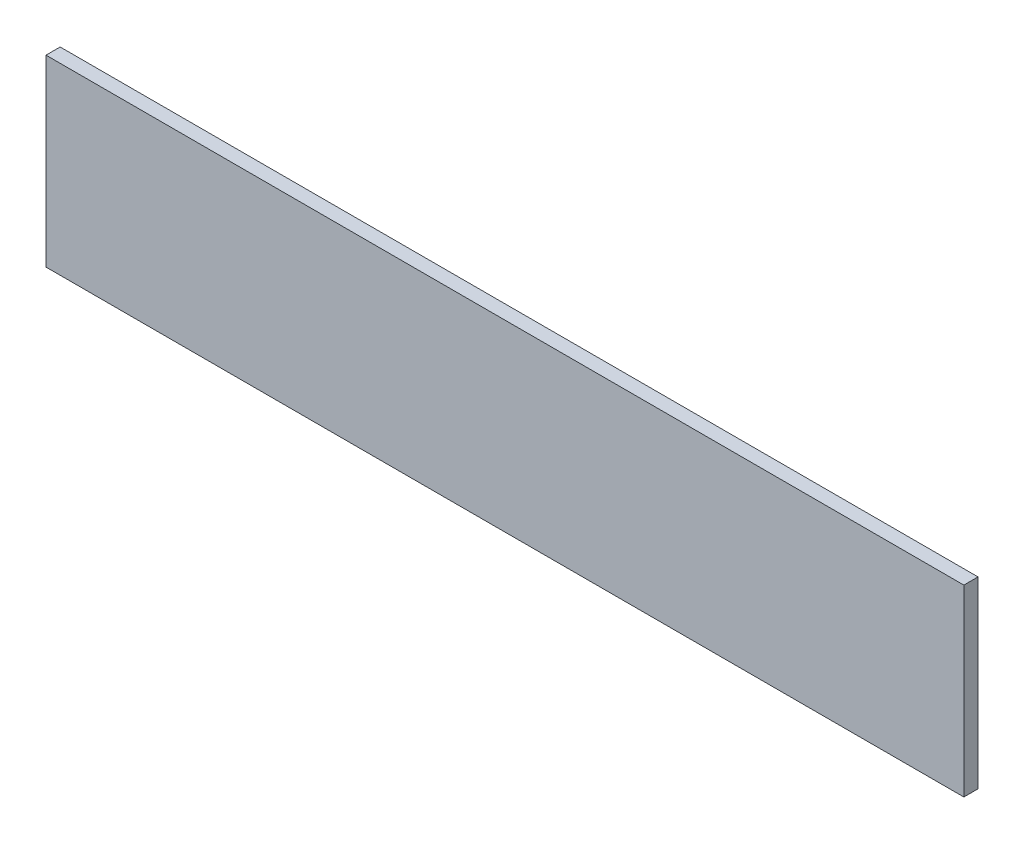
ISO-10303-21;
HEADER;
FILE_DESCRIPTION(('STEP AP214'),'2;1');
FILE_NAME('part.step','',(''),(''),'','','');
FILE_SCHEMA(('AUTOMOTIVE_DESIGN { 1 0 10303 214 1 1 1 1 }'));
ENDSEC;
DATA;
#1=APPLICATION_CONTEXT('core data for automotive mechanical design processes');
#2=APPLICATION_PROTOCOL_DEFINITION('international standard','automotive_design',2000,#1);
#3=PRODUCT_CONTEXT('',#1,'mechanical');
#4=PRODUCT('Part','Part','',(#3));
#5=PRODUCT_RELATED_PRODUCT_CATEGORY('part','',(#4));
#6=PRODUCT_DEFINITION_FORMATION('','',#4);
#7=PRODUCT_DEFINITION_CONTEXT('part definition',#1,'design');
#8=PRODUCT_DEFINITION('design','',#6,#7);
#9=PRODUCT_DEFINITION_SHAPE('','',#8);
#10=(LENGTH_UNIT() NAMED_UNIT(*) SI_UNIT(.MILLI.,.METRE.));
#11=(NAMED_UNIT(*) PLANE_ANGLE_UNIT() SI_UNIT($,.RADIAN.));
#12=(NAMED_UNIT(*) SI_UNIT($,.STERADIAN.) SOLID_ANGLE_UNIT());
#13=UNCERTAINTY_MEASURE_WITH_UNIT(LENGTH_MEASURE(1.E-05),#10,'distance_accuracy_value','');
#14=(GEOMETRIC_REPRESENTATION_CONTEXT(3) GLOBAL_UNCERTAINTY_ASSIGNED_CONTEXT((#13)) GLOBAL_UNIT_ASSIGNED_CONTEXT((#10,
#11,#12)) REPRESENTATION_CONTEXT('',''));
#15=CARTESIAN_POINT('',(0.,0.,0.));
#16=DIRECTION('',(0.,0.,1.));
#17=DIRECTION('',(1.,0.,0.));
#18=AXIS2_PLACEMENT_3D('',#15,#16,#17);
#19=CARTESIAN_POINT('',(40.0931352948155,17.0250433275563,3.));
#20=DIRECTION('',(-1.,0.,0.));
#21=DIRECTION('',(0.,0.,1.));
#22=AXIS2_PLACEMENT_3D('',#19,#20,#21);
#23=PLANE('',#22);
#24=DIRECTION('',(0.,1.,0.));
#25=VECTOR('',#24,1.);
#26=CARTESIAN_POINT('',(40.0931352948155,17.0250433275563,0.));
#27=LINE('',#26,#25);
#28=CARTESIAN_POINT('',(40.0931352948155,-21.8893414211439,0.));
#29=VERTEX_POINT('',#28);
#30=CARTESIAN_POINT('',(40.0931352948155,17.0250433275563,0.));
#31=VERTEX_POINT('',#30);
#32=EDGE_CURVE('E98',#29,#31,#27,.T.);
#33=ORIENTED_EDGE('',*,*,#32,.T.);
#34=DIRECTION('',(0.,0.,-1.));
#35=VECTOR('',#34,1.);
#36=CARTESIAN_POINT('',(40.0931352948155,17.0250433275563,3.));
#37=LINE('',#36,#35);
#38=CARTESIAN_POINT('',(40.0931352948155,17.0250433275563,3.));
#39=VERTEX_POINT('',#38);
#40=EDGE_CURVE('E11',#39,#31,#37,.T.);
#41=ORIENTED_EDGE('',*,*,#40,.F.);
#42=DIRECTION('',(0.,1.,0.));
#43=VECTOR('',#42,1.);
#44=CARTESIAN_POINT('',(40.0931352948155,17.0250433275563,3.));
#45=LINE('',#44,#43);
#46=CARTESIAN_POINT('',(40.0931352948155,-21.8893414211439,3.));
#47=VERTEX_POINT('',#46);
#48=EDGE_CURVE('E86',#47,#39,#45,.T.);
#49=ORIENTED_EDGE('',*,*,#48,.F.);
#50=DIRECTION('',(0.,0.,-1.));
#51=VECTOR('',#50,1.);
#52=CARTESIAN_POINT('',(40.0931352948155,-21.8893414211439,3.));
#53=LINE('',#52,#51);
#54=EDGE_CURVE('E94',#47,#29,#53,.T.);
#55=ORIENTED_EDGE('',*,*,#54,.T.);
#56=EDGE_LOOP('',(#33,#41,#49,#55));
#57=FACE_BOUND('',#56,.T.);
#58=ADVANCED_FACE('F35',(#57),#23,.F.);
#59=CARTESIAN_POINT('',(-154.478788448685,17.0250433275563,3.));
#60=DIRECTION('',(0.,-1.,0.));
#61=DIRECTION('',(0.,0.,-1.));
#62=AXIS2_PLACEMENT_3D('',#59,#60,#61);
#63=PLANE('',#62);
#64=DIRECTION('',(-1.,0.,0.));
#65=VECTOR('',#64,1.);
#66=CARTESIAN_POINT('',(-154.478788448685,17.0250433275563,0.));
#67=LINE('',#66,#65);
#68=CARTESIAN_POINT('',(-154.478788448685,17.0250433275563,0.));
#69=VERTEX_POINT('',#68);
#70=EDGE_CURVE('E90',#31,#69,#67,.T.);
#71=ORIENTED_EDGE('',*,*,#70,.T.);
#72=DIRECTION('',(0.,0.,-1.));
#73=VECTOR('',#72,1.);
#74=CARTESIAN_POINT('',(-154.478788448685,17.0250433275563,3.));
#75=LINE('',#74,#73);
#76=CARTESIAN_POINT('',(-154.478788448685,17.0250433275563,3.));
#77=VERTEX_POINT('',#76);
#78=EDGE_CURVE('E43',#77,#69,#75,.T.);
#79=ORIENTED_EDGE('',*,*,#78,.F.);
#80=DIRECTION('',(-1.,0.,0.));
#81=VECTOR('',#80,1.);
#82=CARTESIAN_POINT('',(-154.478788448685,17.0250433275563,3.));
#83=LINE('',#82,#81);
#84=EDGE_CURVE('E81',#39,#77,#83,.T.);
#85=ORIENTED_EDGE('',*,*,#84,.F.);
#86=ORIENTED_EDGE('',*,*,#40,.T.);
#87=EDGE_LOOP('',(#71,#79,#85,#86));
#88=FACE_BOUND('',#87,.T.);
#89=ADVANCED_FACE('F89',(#88),#63,.F.);
#90=CARTESIAN_POINT('',(-154.478788448685,17.0250433275563,3.));
#91=DIRECTION('',(1.,0.,0.));
#92=DIRECTION('',(0.,0.,-1.));
#93=AXIS2_PLACEMENT_3D('',#90,#91,#92);
#94=PLANE('',#93);
#95=DIRECTION('',(0.,-1.,0.));
#96=VECTOR('',#95,1.);
#97=CARTESIAN_POINT('',(-154.478788448685,17.0250433275563,0.));
#98=LINE('',#97,#96);
#99=CARTESIAN_POINT('',(-154.478788448685,-21.8893414211439,0.));
#100=VERTEX_POINT('',#99);
#101=EDGE_CURVE('E68',#69,#100,#98,.T.);
#102=ORIENTED_EDGE('',*,*,#101,.T.);
#103=DIRECTION('',(0.,0.,-1.));
#104=VECTOR('',#103,1.);
#105=CARTESIAN_POINT('',(-154.478788448685,-21.8893414211439,3.));
#106=LINE('',#105,#104);
#107=CARTESIAN_POINT('',(-154.478788448685,-21.8893414211439,3.));
#108=VERTEX_POINT('',#107);
#109=EDGE_CURVE('E91',#108,#100,#106,.T.);
#110=ORIENTED_EDGE('',*,*,#109,.F.);
#111=DIRECTION('',(0.,-1.,0.));
#112=VECTOR('',#111,1.);
#113=CARTESIAN_POINT('',(-154.478788448685,17.0250433275563,3.));
#114=LINE('',#113,#112);
#115=EDGE_CURVE('E84',#77,#108,#114,.T.);
#116=ORIENTED_EDGE('',*,*,#115,.F.);
#117=ORIENTED_EDGE('',*,*,#78,.T.);
#118=EDGE_LOOP('',(#102,#110,#116,#117));
#119=FACE_BOUND('',#118,.T.);
#120=ADVANCED_FACE('F92',(#119),#94,.F.);
#121=CARTESIAN_POINT('',(-154.478788448685,-21.8893414211439,3.));
#122=DIRECTION('',(0.,1.,0.));
#123=DIRECTION('',(0.,0.,1.));
#124=AXIS2_PLACEMENT_3D('',#121,#122,#123);
#125=PLANE('',#124);
#126=DIRECTION('',(1.,0.,0.));
#127=VECTOR('',#126,1.);
#128=CARTESIAN_POINT('',(-154.478788448685,-21.8893414211439,0.));
#129=LINE('',#128,#127);
#130=EDGE_CURVE('E74',#100,#29,#129,.T.);
#131=ORIENTED_EDGE('',*,*,#130,.T.);
#132=ORIENTED_EDGE('',*,*,#54,.F.);
#133=DIRECTION('',(1.,0.,0.));
#134=VECTOR('',#133,1.);
#135=CARTESIAN_POINT('',(-154.478788448685,-21.8893414211439,3.));
#136=LINE('',#135,#134);
#137=EDGE_CURVE('E51',#108,#47,#136,.T.);
#138=ORIENTED_EDGE('',*,*,#137,.F.);
#139=ORIENTED_EDGE('',*,*,#109,.T.);
#140=EDGE_LOOP('',(#131,#132,#138,#139));
#141=FACE_BOUND('',#140,.T.);
#142=ADVANCED_FACE('F105',(#141),#125,.F.);
#143=CARTESIAN_POINT('',(0.,0.,3.));
#144=DIRECTION('',(0.,0.,1.));
#145=DIRECTION('',(1.,0.,0.));
#146=AXIS2_PLACEMENT_3D('',#143,#144,#145);
#147=PLANE('',#146);
#148=ORIENTED_EDGE('',*,*,#48,.T.);
#149=ORIENTED_EDGE('',*,*,#84,.T.);
#150=ORIENTED_EDGE('',*,*,#115,.T.);
#151=ORIENTED_EDGE('',*,*,#137,.T.);
#152=EDGE_LOOP('',(#148,#149,#150,#151));
#153=FACE_BOUND('',#152,.T.);
#154=ADVANCED_FACE('F82',(#153),#147,.T.);
#155=CARTESIAN_POINT('',(0.,0.,0.));
#156=DIRECTION('',(0.,0.,1.));
#157=DIRECTION('',(1.,0.,0.));
#158=AXIS2_PLACEMENT_3D('',#155,#156,#157);
#159=PLANE('',#158);
#160=ORIENTED_EDGE('',*,*,#32,.F.);
#161=ORIENTED_EDGE('',*,*,#130,.F.);
#162=ORIENTED_EDGE('',*,*,#101,.F.);
#163=ORIENTED_EDGE('',*,*,#70,.F.);
#164=EDGE_LOOP('',(#160,#161,#162,#163));
#165=FACE_BOUND('',#164,.T.);
#166=ADVANCED_FACE('F108',(#165),#159,.F.);
#167=CLOSED_SHELL('',(#58,#89,#120,#142,#154,#166));
#168=MANIFOLD_SOLID_BREP('B2',#167);
#169=ADVANCED_BREP_SHAPE_REPRESENTATION('',(#18,#168),#14);
#170=SHAPE_DEFINITION_REPRESENTATION(#9,#169);
ENDSEC;
END-ISO-10303-21;
